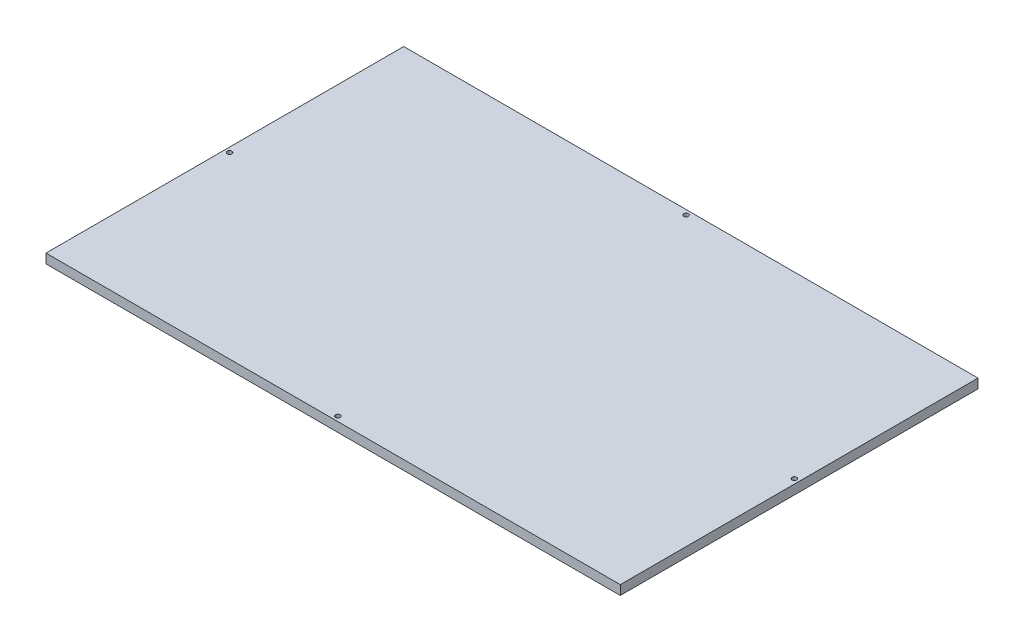
ISO-10303-21;
HEADER;
FILE_DESCRIPTION(('STEP AP214'),'2;1');
FILE_NAME('part.step','',(''),(''),'','','');
FILE_SCHEMA(('AUTOMOTIVE_DESIGN { 1 0 10303 214 1 1 1 1 }'));
ENDSEC;
DATA;
#1=APPLICATION_CONTEXT('core data for automotive mechanical design processes');
#2=APPLICATION_PROTOCOL_DEFINITION('international standard','automotive_design',2000,#1);
#3=PRODUCT_CONTEXT('',#1,'mechanical');
#4=PRODUCT('Part','Part','',(#3));
#5=PRODUCT_RELATED_PRODUCT_CATEGORY('part','',(#4));
#6=PRODUCT_DEFINITION_FORMATION('','',#4);
#7=PRODUCT_DEFINITION_CONTEXT('part definition',#1,'design');
#8=PRODUCT_DEFINITION('design','',#6,#7);
#9=PRODUCT_DEFINITION_SHAPE('','',#8);
#10=(LENGTH_UNIT() NAMED_UNIT(*) SI_UNIT(.MILLI.,.METRE.));
#11=(NAMED_UNIT(*) PLANE_ANGLE_UNIT() SI_UNIT($,.RADIAN.));
#12=(NAMED_UNIT(*) SI_UNIT($,.STERADIAN.) SOLID_ANGLE_UNIT());
#13=UNCERTAINTY_MEASURE_WITH_UNIT(LENGTH_MEASURE(1.E-05),#10,'distance_accuracy_value','');
#14=(GEOMETRIC_REPRESENTATION_CONTEXT(3) GLOBAL_UNCERTAINTY_ASSIGNED_CONTEXT((#13)) GLOBAL_UNIT_ASSIGNED_CONTEXT((#10,
#11,#12)) REPRESENTATION_CONTEXT('',''));
#15=CARTESIAN_POINT('',(0.,0.,0.));
#16=DIRECTION('',(0.,0.,1.));
#17=DIRECTION('',(1.,0.,0.));
#18=AXIS2_PLACEMENT_3D('',#15,#16,#17);
#19=CARTESIAN_POINT('',(305.,10.,-190.));
#20=DIRECTION('',(-1.,0.,0.));
#21=DIRECTION('',(0.,0.,1.));
#22=AXIS2_PLACEMENT_3D('',#19,#20,#21);
#23=PLANE('',#22);
#24=DIRECTION('',(0.,0.,-1.));
#25=VECTOR('',#24,1.);
#26=CARTESIAN_POINT('',(305.,0.,-190.));
#27=LINE('',#26,#25);
#28=CARTESIAN_POINT('',(305.,0.,190.));
#29=VERTEX_POINT('',#28);
#30=CARTESIAN_POINT('',(305.,0.,-190.));
#31=VERTEX_POINT('',#30);
#32=EDGE_CURVE('E97',#29,#31,#27,.T.);
#33=ORIENTED_EDGE('',*,*,#32,.T.);
#34=DIRECTION('',(0.,-1.,0.));
#35=VECTOR('',#34,1.);
#36=CARTESIAN_POINT('',(305.,10.,-190.));
#37=LINE('',#36,#35);
#38=CARTESIAN_POINT('',(305.,10.,-190.));
#39=VERTEX_POINT('',#38);
#40=EDGE_CURVE('E11',#39,#31,#37,.T.);
#41=ORIENTED_EDGE('',*,*,#40,.F.);
#42=DIRECTION('',(0.,0.,-1.));
#43=VECTOR('',#42,1.);
#44=CARTESIAN_POINT('',(305.,10.,-190.));
#45=LINE('',#44,#43);
#46=CARTESIAN_POINT('',(305.,10.,190.));
#47=VERTEX_POINT('',#46);
#48=EDGE_CURVE('E85',#47,#39,#45,.T.);
#49=ORIENTED_EDGE('',*,*,#48,.F.);
#50=DIRECTION('',(0.,-1.,0.));
#51=VECTOR('',#50,1.);
#52=CARTESIAN_POINT('',(305.,10.,190.));
#53=LINE('',#52,#51);
#54=EDGE_CURVE('E93',#47,#29,#53,.T.);
#55=ORIENTED_EDGE('',*,*,#54,.T.);
#56=EDGE_LOOP('',(#33,#41,#49,#55));
#57=FACE_BOUND('',#56,.T.);
#58=ADVANCED_FACE('F34',(#57),#23,.F.);
#59=CARTESIAN_POINT('',(-305.,10.,-190.));
#60=DIRECTION('',(0.,0.,1.));
#61=DIRECTION('',(1.,0.,0.));
#62=AXIS2_PLACEMENT_3D('',#59,#60,#61);
#63=PLANE('',#62);
#64=DIRECTION('',(-1.,0.,0.));
#65=VECTOR('',#64,1.);
#66=CARTESIAN_POINT('',(-305.,0.,-190.));
#67=LINE('',#66,#65);
#68=CARTESIAN_POINT('',(-305.,0.,-190.));
#69=VERTEX_POINT('',#68);
#70=EDGE_CURVE('E89',#31,#69,#67,.T.);
#71=ORIENTED_EDGE('',*,*,#70,.T.);
#72=DIRECTION('',(0.,-1.,0.));
#73=VECTOR('',#72,1.);
#74=CARTESIAN_POINT('',(-305.,10.,-190.));
#75=LINE('',#74,#73);
#76=CARTESIAN_POINT('',(-305.,10.,-190.));
#77=VERTEX_POINT('',#76);
#78=EDGE_CURVE('E42',#77,#69,#75,.T.);
#79=ORIENTED_EDGE('',*,*,#78,.F.);
#80=DIRECTION('',(-1.,0.,0.));
#81=VECTOR('',#80,1.);
#82=CARTESIAN_POINT('',(-305.,10.,-190.));
#83=LINE('',#82,#81);
#84=EDGE_CURVE('E80',#39,#77,#83,.T.);
#85=ORIENTED_EDGE('',*,*,#84,.F.);
#86=ORIENTED_EDGE('',*,*,#40,.T.);
#87=EDGE_LOOP('',(#71,#79,#85,#86));
#88=FACE_BOUND('',#87,.T.);
#89=ADVANCED_FACE('F88',(#88),#63,.F.);
#90=CARTESIAN_POINT('',(-305.,10.,-190.));
#91=DIRECTION('',(1.,0.,0.));
#92=DIRECTION('',(0.,0.,-1.));
#93=AXIS2_PLACEMENT_3D('',#90,#91,#92);
#94=PLANE('',#93);
#95=DIRECTION('',(0.,0.,1.));
#96=VECTOR('',#95,1.);
#97=CARTESIAN_POINT('',(-305.,0.,-190.));
#98=LINE('',#97,#96);
#99=CARTESIAN_POINT('',(-305.,0.,190.));
#100=VERTEX_POINT('',#99);
#101=EDGE_CURVE('E67',#69,#100,#98,.T.);
#102=ORIENTED_EDGE('',*,*,#101,.T.);
#103=DIRECTION('',(0.,-1.,0.));
#104=VECTOR('',#103,1.);
#105=CARTESIAN_POINT('',(-305.,10.,190.));
#106=LINE('',#105,#104);
#107=CARTESIAN_POINT('',(-305.,10.,190.));
#108=VERTEX_POINT('',#107);
#109=EDGE_CURVE('E90',#108,#100,#106,.T.);
#110=ORIENTED_EDGE('',*,*,#109,.F.);
#111=DIRECTION('',(0.,0.,1.));
#112=VECTOR('',#111,1.);
#113=CARTESIAN_POINT('',(-305.,10.,-190.));
#114=LINE('',#113,#112);
#115=EDGE_CURVE('E83',#77,#108,#114,.T.);
#116=ORIENTED_EDGE('',*,*,#115,.F.);
#117=ORIENTED_EDGE('',*,*,#78,.T.);
#118=EDGE_LOOP('',(#102,#110,#116,#117));
#119=FACE_BOUND('',#118,.T.);
#120=ADVANCED_FACE('F91',(#119),#94,.F.);
#121=CARTESIAN_POINT('',(-305.,10.,190.));
#122=DIRECTION('',(0.,0.,-1.));
#123=DIRECTION('',(-1.,0.,0.));
#124=AXIS2_PLACEMENT_3D('',#121,#122,#123);
#125=PLANE('',#124);
#126=DIRECTION('',(1.,0.,0.));
#127=VECTOR('',#126,1.);
#128=CARTESIAN_POINT('',(-305.,0.,190.));
#129=LINE('',#128,#127);
#130=EDGE_CURVE('E73',#100,#29,#129,.T.);
#131=ORIENTED_EDGE('',*,*,#130,.T.);
#132=ORIENTED_EDGE('',*,*,#54,.F.);
#133=DIRECTION('',(1.,0.,0.));
#134=VECTOR('',#133,1.);
#135=CARTESIAN_POINT('',(-305.,10.,190.));
#136=LINE('',#135,#134);
#137=EDGE_CURVE('E50',#108,#47,#136,.T.);
#138=ORIENTED_EDGE('',*,*,#137,.F.);
#139=ORIENTED_EDGE('',*,*,#109,.T.);
#140=EDGE_LOOP('',(#131,#132,#138,#139));
#141=FACE_BOUND('',#140,.T.);
#142=ADVANCED_FACE('F105',(#141),#125,.F.);
#143=CARTESIAN_POINT('',(0.,10.,0.));
#144=DIRECTION('',(0.,1.,0.));
#145=DIRECTION('',(0.,0.,1.));
#146=AXIS2_PLACEMENT_3D('',#143,#144,#145);
#147=PLANE('',#146);
#148=CARTESIAN_POINT('',(300.,10.,1.11022302462516E-13));
#149=DIRECTION('',(0.,1.,0.));
#150=DIRECTION('',(0.,0.,1.));
#151=AXIS2_PLACEMENT_3D('',#148,#149,#150);
#152=CIRCLE('',#151,2.50000000000002);
#153=CARTESIAN_POINT('',(300.,10.,2.50000000000013));
#154=VERTEX_POINT('',#153);
#155=EDGE_CURVE('E129',#154,#154,#152,.T.);
#156=ORIENTED_EDGE('',*,*,#155,.F.);
#157=EDGE_LOOP('',(#156));
#158=FACE_BOUND('',#157,.T.);
#159=CARTESIAN_POINT('',(0.,10.,-185.));
#160=DIRECTION('',(0.,1.,0.));
#161=DIRECTION('',(0.,0.,1.));
#162=AXIS2_PLACEMENT_3D('',#159,#160,#161);
#163=CIRCLE('',#162,2.5);
#164=CARTESIAN_POINT('',(0.,10.,-182.5));
#165=VERTEX_POINT('',#164);
#166=EDGE_CURVE('E123',#165,#165,#163,.T.);
#167=ORIENTED_EDGE('',*,*,#166,.F.);
#168=EDGE_LOOP('',(#167));
#169=FACE_BOUND('',#168,.T.);
#170=CARTESIAN_POINT('',(-300.,10.,1.11022302462516E-13));
#171=DIRECTION('',(0.,1.,0.));
#172=DIRECTION('',(0.,0.,1.));
#173=AXIS2_PLACEMENT_3D('',#170,#171,#172);
#174=CIRCLE('',#173,2.50000000000002);
#175=CARTESIAN_POINT('',(-300.,10.,2.50000000000013));
#176=VERTEX_POINT('',#175);
#177=EDGE_CURVE('E117',#176,#176,#174,.T.);
#178=ORIENTED_EDGE('',*,*,#177,.F.);
#179=EDGE_LOOP('',(#178));
#180=FACE_BOUND('',#179,.T.);
#181=CARTESIAN_POINT('',(1.11022302462516E-13,10.,185.));
#182=DIRECTION('',(0.,1.,0.));
#183=DIRECTION('',(0.,0.,1.));
#184=AXIS2_PLACEMENT_3D('',#181,#182,#183);
#185=CIRCLE('',#184,2.5);
#186=CARTESIAN_POINT('',(1.11022302462516E-13,10.,187.5));
#187=VERTEX_POINT('',#186);
#188=EDGE_CURVE('E111',#187,#187,#185,.T.);
#189=ORIENTED_EDGE('',*,*,#188,.F.);
#190=EDGE_LOOP('',(#189));
#191=FACE_BOUND('',#190,.T.);
#192=ORIENTED_EDGE('',*,*,#48,.T.);
#193=ORIENTED_EDGE('',*,*,#84,.T.);
#194=ORIENTED_EDGE('',*,*,#115,.T.);
#195=ORIENTED_EDGE('',*,*,#137,.T.);
#196=EDGE_LOOP('',(#192,#193,#194,#195));
#197=FACE_BOUND('',#196,.T.);
#198=ADVANCED_FACE('F81',(#158,#169,#180,#191,#197),#147,.T.);
#199=CARTESIAN_POINT('',(0.,0.,0.));
#200=DIRECTION('',(0.,1.,0.));
#201=DIRECTION('',(0.,0.,1.));
#202=AXIS2_PLACEMENT_3D('',#199,#200,#201);
#203=PLANE('',#202);
#204=CARTESIAN_POINT('',(300.,0.,1.11022302462516E-13));
#205=DIRECTION('',(0.,1.,0.));
#206=DIRECTION('',(0.,0.,1.));
#207=AXIS2_PLACEMENT_3D('',#204,#205,#206);
#208=CIRCLE('',#207,2.50000000000002);
#209=CARTESIAN_POINT('',(300.,0.,2.50000000000013));
#210=VERTEX_POINT('',#209);
#211=EDGE_CURVE('E100',#210,#210,#208,.T.);
#212=ORIENTED_EDGE('',*,*,#211,.T.);
#213=EDGE_LOOP('',(#212));
#214=FACE_BOUND('',#213,.T.);
#215=CARTESIAN_POINT('',(0.,0.,-185.));
#216=DIRECTION('',(0.,1.,0.));
#217=DIRECTION('',(0.,0.,1.));
#218=AXIS2_PLACEMENT_3D('',#215,#216,#217);
#219=CIRCLE('',#218,2.5);
#220=CARTESIAN_POINT('',(0.,0.,-182.5));
#221=VERTEX_POINT('',#220);
#222=EDGE_CURVE('E126',#221,#221,#219,.T.);
#223=ORIENTED_EDGE('',*,*,#222,.T.);
#224=EDGE_LOOP('',(#223));
#225=FACE_BOUND('',#224,.T.);
#226=CARTESIAN_POINT('',(-300.,0.,1.11022302462516E-13));
#227=DIRECTION('',(0.,1.,0.));
#228=DIRECTION('',(0.,0.,1.));
#229=AXIS2_PLACEMENT_3D('',#226,#227,#228);
#230=CIRCLE('',#229,2.50000000000002);
#231=CARTESIAN_POINT('',(-300.,0.,2.50000000000013));
#232=VERTEX_POINT('',#231);
#233=EDGE_CURVE('E120',#232,#232,#230,.T.);
#234=ORIENTED_EDGE('',*,*,#233,.T.);
#235=EDGE_LOOP('',(#234));
#236=FACE_BOUND('',#235,.T.);
#237=CARTESIAN_POINT('',(1.11022302462516E-13,0.,185.));
#238=DIRECTION('',(0.,1.,0.));
#239=DIRECTION('',(0.,0.,1.));
#240=AXIS2_PLACEMENT_3D('',#237,#238,#239);
#241=CIRCLE('',#240,2.5);
#242=CARTESIAN_POINT('',(1.11022302462516E-13,0.,187.5));
#243=VERTEX_POINT('',#242);
#244=EDGE_CURVE('E114',#243,#243,#241,.T.);
#245=ORIENTED_EDGE('',*,*,#244,.T.);
#246=EDGE_LOOP('',(#245));
#247=FACE_BOUND('',#246,.T.);
#248=ORIENTED_EDGE('',*,*,#32,.F.);
#249=ORIENTED_EDGE('',*,*,#130,.F.);
#250=ORIENTED_EDGE('',*,*,#101,.F.);
#251=ORIENTED_EDGE('',*,*,#70,.F.);
#252=EDGE_LOOP('',(#248,#249,#250,#251));
#253=FACE_BOUND('',#252,.T.);
#254=ADVANCED_FACE('F108',(#214,#225,#236,#247,#253),#203,.F.);
#255=CARTESIAN_POINT('',(1.11022302462516E-13,0.,185.));
#256=DIRECTION('',(0.,1.,0.));
#257=DIRECTION('',(0.,0.,1.));
#258=AXIS2_PLACEMENT_3D('',#255,#256,#257);
#259=CYLINDRICAL_SURFACE('',#258,2.5);
#260=ORIENTED_EDGE('',*,*,#244,.F.);
#261=EDGE_LOOP('',(#260));
#262=FACE_BOUND('',#261,.T.);
#263=ORIENTED_EDGE('',*,*,#188,.T.);
#264=EDGE_LOOP('',(#263));
#265=FACE_BOUND('',#264,.T.);
#266=ADVANCED_FACE('F153',(#262,#265),#259,.F.);
#267=CARTESIAN_POINT('',(-300.,0.,1.11022302462516E-13));
#268=DIRECTION('',(0.,1.,0.));
#269=DIRECTION('',(0.,0.,1.));
#270=AXIS2_PLACEMENT_3D('',#267,#268,#269);
#271=CYLINDRICAL_SURFACE('',#270,2.50000000000002);
#272=ORIENTED_EDGE('',*,*,#233,.F.);
#273=EDGE_LOOP('',(#272));
#274=FACE_BOUND('',#273,.T.);
#275=ORIENTED_EDGE('',*,*,#177,.T.);
#276=EDGE_LOOP('',(#275));
#277=FACE_BOUND('',#276,.T.);
#278=ADVANCED_FACE('F155',(#274,#277),#271,.F.);
#279=CARTESIAN_POINT('',(0.,0.,-185.));
#280=DIRECTION('',(0.,1.,0.));
#281=DIRECTION('',(0.,0.,1.));
#282=AXIS2_PLACEMENT_3D('',#279,#280,#281);
#283=CYLINDRICAL_SURFACE('',#282,2.5);
#284=ORIENTED_EDGE('',*,*,#222,.F.);
#285=EDGE_LOOP('',(#284));
#286=FACE_BOUND('',#285,.T.);
#287=ORIENTED_EDGE('',*,*,#166,.T.);
#288=EDGE_LOOP('',(#287));
#289=FACE_BOUND('',#288,.T.);
#290=ADVANCED_FACE('F140',(#286,#289),#283,.F.);
#291=CARTESIAN_POINT('',(300.,0.,1.11022302462516E-13));
#292=DIRECTION('',(0.,1.,0.));
#293=DIRECTION('',(0.,0.,1.));
#294=AXIS2_PLACEMENT_3D('',#291,#292,#293);
#295=CYLINDRICAL_SURFACE('',#294,2.50000000000002);
#296=ORIENTED_EDGE('',*,*,#211,.F.);
#297=EDGE_LOOP('',(#296));
#298=FACE_BOUND('',#297,.T.);
#299=ORIENTED_EDGE('',*,*,#155,.T.);
#300=EDGE_LOOP('',(#299));
#301=FACE_BOUND('',#300,.T.);
#302=ADVANCED_FACE('F137',(#298,#301),#295,.F.);
#303=CLOSED_SHELL('',(#58,#89,#120,#142,#198,#254,#266,#278,#290,#302));
#304=MANIFOLD_SOLID_BREP('B2',#303);
#305=ADVANCED_BREP_SHAPE_REPRESENTATION('',(#18,#304),#14);
#306=SHAPE_DEFINITION_REPRESENTATION(#9,#305);
ENDSEC;
END-ISO-10303-21;
